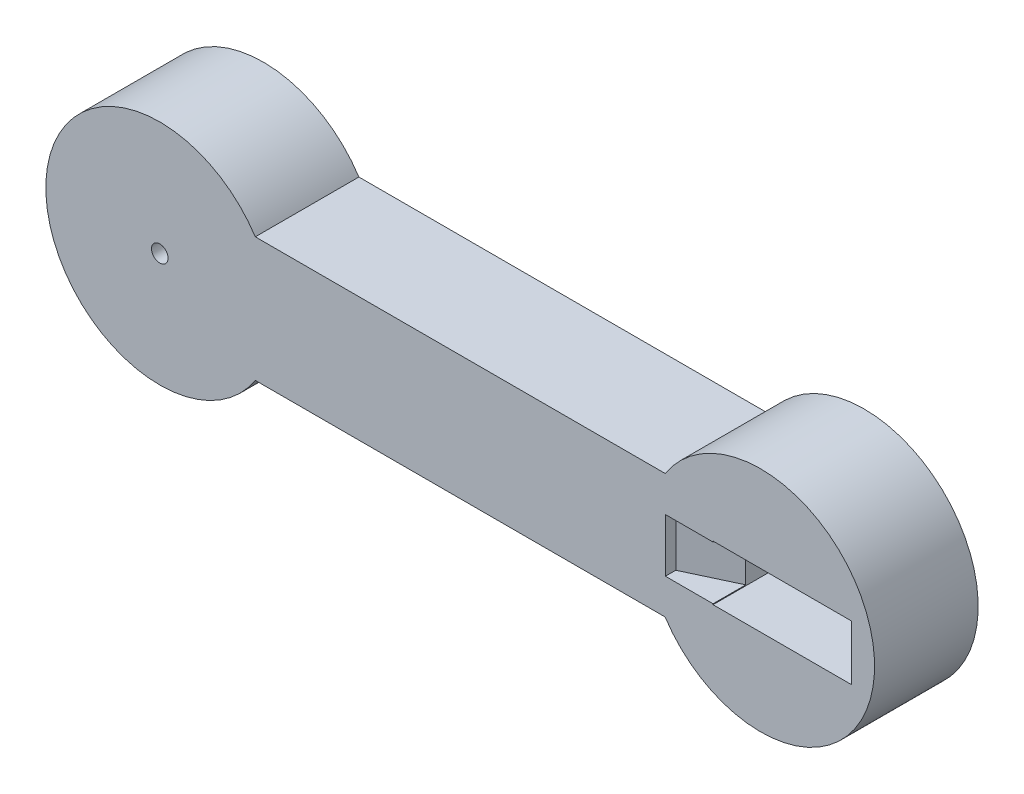
ISO-10303-21;
HEADER;
FILE_DESCRIPTION(('STEP AP214'),'2;1');
FILE_NAME('part.step','',(''),(''),'','','');
FILE_SCHEMA(('AUTOMOTIVE_DESIGN { 1 0 10303 214 1 1 1 1 }'));
ENDSEC;
DATA;
#1=APPLICATION_CONTEXT('core data for automotive mechanical design processes');
#2=APPLICATION_PROTOCOL_DEFINITION('international standard','automotive_design',2000,#1);
#3=PRODUCT_CONTEXT('',#1,'mechanical');
#4=PRODUCT('Part','Part','',(#3));
#5=PRODUCT_RELATED_PRODUCT_CATEGORY('part','',(#4));
#6=PRODUCT_DEFINITION_FORMATION('','',#4);
#7=PRODUCT_DEFINITION_CONTEXT('part definition',#1,'design');
#8=PRODUCT_DEFINITION('design','',#6,#7);
#9=PRODUCT_DEFINITION_SHAPE('','',#8);
#10=(LENGTH_UNIT() NAMED_UNIT(*) SI_UNIT(.MILLI.,.METRE.));
#11=(NAMED_UNIT(*) PLANE_ANGLE_UNIT() SI_UNIT($,.RADIAN.));
#12=(NAMED_UNIT(*) SI_UNIT($,.STERADIAN.) SOLID_ANGLE_UNIT());
#13=UNCERTAINTY_MEASURE_WITH_UNIT(LENGTH_MEASURE(1.E-05),#10,'distance_accuracy_value','');
#14=(GEOMETRIC_REPRESENTATION_CONTEXT(3) GLOBAL_UNCERTAINTY_ASSIGNED_CONTEXT((#13)) GLOBAL_UNIT_ASSIGNED_CONTEXT((#10,
#11,#12)) REPRESENTATION_CONTEXT('',''));
#15=CARTESIAN_POINT('',(0.,0.,0.));
#16=DIRECTION('',(0.,0.,1.));
#17=DIRECTION('',(1.,0.,0.));
#18=AXIS2_PLACEMENT_3D('',#15,#16,#17);
#19=CARTESIAN_POINT('',(0.,0.,25.));
#20=DIRECTION('',(0.,0.,1.));
#21=DIRECTION('',(1.,0.,0.));
#22=AXIS2_PLACEMENT_3D('',#19,#20,#21);
#23=PLANE('',#22);
#24=CARTESIAN_POINT('',(0.,0.,25.));
#25=DIRECTION('',(0.,0.,1.));
#26=DIRECTION('',(1.,0.,0.));
#27=AXIS2_PLACEMENT_3D('',#24,#25,#26);
#28=CIRCLE('',#27,2.);
#29=CARTESIAN_POINT('',(2.,0.,25.));
#30=VERTEX_POINT('',#29);
#31=EDGE_CURVE('E416',#30,#30,#28,.T.);
#32=ORIENTED_EDGE('',*,*,#31,.F.);
#33=EDGE_LOOP('',(#32));
#34=FACE_BOUND('',#33,.T.);
#35=DIRECTION('',(0.,1.,0.));
#36=VECTOR('',#35,1.);
#37=CARTESIAN_POINT('',(133.519342789878,6.64999999999998,25.));
#38=LINE('',#37,#36);
#39=CARTESIAN_POINT('',(133.519342789878,6.45,25.));
#40=VERTEX_POINT('',#39);
#41=CARTESIAN_POINT('',(133.519342789878,6.64999999999998,25.));
#42=VERTEX_POINT('',#41);
#43=EDGE_CURVE('E218',#40,#42,#38,.T.);
#44=ORIENTED_EDGE('',*,*,#43,.T.);
#45=DIRECTION('',(-1.,0.,0.));
#46=VECTOR('',#45,1.);
#47=CARTESIAN_POINT('',(0.,6.64999999999998,25.));
#48=LINE('',#47,#46);
#49=CARTESIAN_POINT('',(166.919342789878,6.64999999999998,25.));
#50=VERTEX_POINT('',#49);
#51=EDGE_CURVE('E202',#50,#42,#48,.T.);
#52=ORIENTED_EDGE('',*,*,#51,.F.);
#53=DIRECTION('',(0.,-1.,0.));
#54=VECTOR('',#53,1.);
#55=CARTESIAN_POINT('',(166.919342789878,6.64999999999998,25.));
#56=LINE('',#55,#54);
#57=CARTESIAN_POINT('',(166.919342789878,-6.65000000000003,25.));
#58=VERTEX_POINT('',#57);
#59=EDGE_CURVE('E209',#50,#58,#56,.T.);
#60=ORIENTED_EDGE('',*,*,#59,.T.);
#61=DIRECTION('',(1.,0.,0.));
#62=VECTOR('',#61,1.);
#63=CARTESIAN_POINT('',(0.,-6.65000000000002,25.));
#64=LINE('',#63,#62);
#65=CARTESIAN_POINT('',(133.519342789878,-6.65000000000003,25.));
#66=VERTEX_POINT('',#65);
#67=EDGE_CURVE('E187',#66,#58,#64,.T.);
#68=ORIENTED_EDGE('',*,*,#67,.F.);
#69=CARTESIAN_POINT('',(133.519342789878,-6.45,25.));
#70=VERTEX_POINT('',#69);
#71=EDGE_CURVE('E212',#66,#70,#38,.T.);
#72=ORIENTED_EDGE('',*,*,#71,.T.);
#73=DIRECTION('',(-1.,0.,0.));
#74=VECTOR('',#73,1.);
#75=CARTESIAN_POINT('',(0.,-6.45,25.));
#76=LINE('',#75,#74);
#77=CARTESIAN_POINT('',(122.019342789878,-6.45,25.));
#78=VERTEX_POINT('',#77);
#79=EDGE_CURVE('E257',#70,#78,#76,.T.);
#80=ORIENTED_EDGE('',*,*,#79,.T.);
#81=DIRECTION('',(0.,-1.,0.));
#82=VECTOR('',#81,1.);
#83=CARTESIAN_POINT('',(122.019342789878,6.45,25.));
#84=LINE('',#83,#82);
#85=CARTESIAN_POINT('',(122.019342789878,6.45,25.));
#86=VERTEX_POINT('',#85);
#87=EDGE_CURVE('E270',#86,#78,#84,.T.);
#88=ORIENTED_EDGE('',*,*,#87,.F.);
#89=DIRECTION('',(-1.,0.,0.));
#90=VECTOR('',#89,1.);
#91=CARTESIAN_POINT('',(0.,6.45,25.));
#92=LINE('',#91,#90);
#93=EDGE_CURVE('E258',#40,#86,#92,.T.);
#94=ORIENTED_EDGE('',*,*,#93,.F.);
#95=EDGE_LOOP('',(#44,#52,#60,#68,#72,#80,#88,#94));
#96=FACE_BOUND('',#95,.T.);
#97=CARTESIAN_POINT('',(0.,0.,25.));
#98=DIRECTION('',(0.,0.,1.));
#99=DIRECTION('',(1.,0.,0.));
#100=AXIS2_PLACEMENT_3D('',#97,#98,#99);
#101=CIRCLE('',#100,27.5);
#102=CARTESIAN_POINT('',(23.0488611432322,15.,25.));
#103=VERTEX_POINT('',#102);
#104=CARTESIAN_POINT('',(23.0488611432322,-15.,25.));
#105=VERTEX_POINT('',#104);
#106=EDGE_CURVE('E354',#103,#105,#101,.T.);
#107=ORIENTED_EDGE('',*,*,#106,.T.);
#108=DIRECTION('',(1.,0.,0.));
#109=VECTOR('',#108,1.);
#110=CARTESIAN_POINT('',(0.,-15.,25.));
#111=LINE('',#110,#109);
#112=CARTESIAN_POINT('',(121.951138856768,-15.,25.));
#113=VERTEX_POINT('',#112);
#114=EDGE_CURVE('E358',#105,#113,#111,.T.);
#115=ORIENTED_EDGE('',*,*,#114,.T.);
#116=CARTESIAN_POINT('',(145.,0.,25.));
#117=DIRECTION('',(0.,0.,1.));
#118=DIRECTION('',(1.,0.,0.));
#119=AXIS2_PLACEMENT_3D('',#116,#117,#118);
#120=CIRCLE('',#119,27.5);
#121=CARTESIAN_POINT('',(121.951138856768,15.,25.));
#122=VERTEX_POINT('',#121);
#123=EDGE_CURVE('E362',#113,#122,#120,.T.);
#124=ORIENTED_EDGE('',*,*,#123,.T.);
#125=DIRECTION('',(1.,0.,0.));
#126=VECTOR('',#125,1.);
#127=CARTESIAN_POINT('',(0.,15.,25.));
#128=LINE('',#127,#126);
#129=EDGE_CURVE('E365',#103,#122,#128,.T.);
#130=ORIENTED_EDGE('',*,*,#129,.F.);
#131=EDGE_LOOP('',(#107,#115,#124,#130));
#132=FACE_BOUND('',#131,.T.);
#133=ADVANCED_FACE('F49',(#34,#96,#132),#23,.T.);
#134=CARTESIAN_POINT('',(138.019342789879,0.,25.));
#135=DIRECTION('',(1.,0.,0.));
#136=DIRECTION('',(0.,0.,-1.));
#137=AXIS2_PLACEMENT_3D('',#134,#135,#136);
#138=PLANE('',#137);
#139=DIRECTION('',(0.,1.,0.));
#140=VECTOR('',#139,1.);
#141=CARTESIAN_POINT('',(138.019342789879,0.,6.5));
#142=LINE('',#141,#140);
#143=CARTESIAN_POINT('',(138.019342789879,-6.65000000000003,6.5));
#144=VERTEX_POINT('',#143);
#145=CARTESIAN_POINT('',(138.019342789879,6.64999999999998,6.5));
#146=VERTEX_POINT('',#145);
#147=EDGE_CURVE('E254',#144,#146,#142,.T.);
#148=ORIENTED_EDGE('',*,*,#147,.F.);
#149=DIRECTION('',(0.,0.,-1.));
#150=VECTOR('',#149,1.);
#151=CARTESIAN_POINT('',(138.019342789879,-6.65000000000003,25.));
#152=LINE('',#151,#150);
#153=CARTESIAN_POINT('',(138.019342789879,-6.65000000000003,4.5));
#154=VERTEX_POINT('',#153);
#155=EDGE_CURVE('E288',#144,#154,#152,.T.);
#156=ORIENTED_EDGE('',*,*,#155,.T.);
#157=DIRECTION('',(0.,-1.,0.));
#158=VECTOR('',#157,1.);
#159=CARTESIAN_POINT('',(138.019342789879,0.,4.5));
#160=LINE('',#159,#158);
#161=CARTESIAN_POINT('',(138.019342789879,6.64999999999998,4.5));
#162=VERTEX_POINT('',#161);
#163=EDGE_CURVE('E400',#162,#154,#160,.T.);
#164=ORIENTED_EDGE('',*,*,#163,.F.);
#165=DIRECTION('',(0.,0.,-1.));
#166=VECTOR('',#165,1.);
#167=CARTESIAN_POINT('',(138.019342789879,6.64999999999998,25.));
#168=LINE('',#167,#166);
#169=EDGE_CURVE('E201',#146,#162,#168,.T.);
#170=ORIENTED_EDGE('',*,*,#169,.F.);
#171=EDGE_LOOP('',(#148,#156,#164,#170));
#172=FACE_BOUND('',#171,.T.);
#173=ADVANCED_FACE('F429',(#172),#138,.T.);
#174=CARTESIAN_POINT('',(0.,0.,4.5));
#175=DIRECTION('',(0.,0.,-1.));
#176=DIRECTION('',(-1.,0.,0.));
#177=AXIS2_PLACEMENT_3D('',#174,#175,#176);
#178=PLANE('',#177);
#179=CARTESIAN_POINT('',(136.249999956768,0.,4.5));
#180=DIRECTION('',(0.,0.,-1.));
#181=DIRECTION('',(-1.,0.,0.));
#182=AXIS2_PLACEMENT_3D('',#179,#180,#181);
#183=CIRCLE('',#182,1.09999999999999);
#184=CARTESIAN_POINT('',(135.149999956768,0.,4.5));
#185=VERTEX_POINT('',#184);
#186=EDGE_CURVE('E227',#185,#185,#183,.T.);
#187=ORIENTED_EDGE('',*,*,#186,.F.);
#188=EDGE_LOOP('',(#187));
#189=FACE_BOUND('',#188,.T.);
#190=DIRECTION('',(1.,0.,0.));
#191=VECTOR('',#190,1.);
#192=CARTESIAN_POINT('',(133.519342789879,6.64999999999998,4.5));
#193=LINE('',#192,#191);
#194=CARTESIAN_POINT('',(133.519342789879,6.64999999999998,4.5));
#195=VERTEX_POINT('',#194);
#196=EDGE_CURVE('E314',#195,#162,#193,.T.);
#197=ORIENTED_EDGE('',*,*,#196,.T.);
#198=ORIENTED_EDGE('',*,*,#163,.T.);
#199=DIRECTION('',(-1.,0.,0.));
#200=VECTOR('',#199,1.);
#201=CARTESIAN_POINT('',(133.519342789879,-6.65000000000003,4.5));
#202=LINE('',#201,#200);
#203=CARTESIAN_POINT('',(133.519342789879,-6.65000000000003,4.5));
#204=VERTEX_POINT('',#203);
#205=EDGE_CURVE('E322',#154,#204,#202,.T.);
#206=ORIENTED_EDGE('',*,*,#205,.T.);
#207=DIRECTION('',(0.,1.,0.));
#208=VECTOR('',#207,1.);
#209=CARTESIAN_POINT('',(133.519342789879,-6.65000000000003,4.5));
#210=LINE('',#209,#208);
#211=EDGE_CURVE('E308',#204,#195,#210,.T.);
#212=ORIENTED_EDGE('',*,*,#211,.T.);
#213=EDGE_LOOP('',(#197,#198,#206,#212));
#214=FACE_BOUND('',#213,.T.);
#215=ADVANCED_FACE('F436',(#189,#214),#178,.T.);
#216=CARTESIAN_POINT('',(0.,0.,25.));
#217=DIRECTION('',(0.,0.,-1.));
#218=DIRECTION('',(-1.,0.,0.));
#219=AXIS2_PLACEMENT_3D('',#216,#217,#218);
#220=CYLINDRICAL_SURFACE('',#219,27.5);
#221=CARTESIAN_POINT('',(0.,0.,0.));
#222=DIRECTION('',(0.,0.,1.));
#223=DIRECTION('',(1.,0.,0.));
#224=AXIS2_PLACEMENT_3D('',#221,#222,#223);
#225=CIRCLE('',#224,27.5);
#226=CARTESIAN_POINT('',(23.0488611432322,15.,0.));
#227=VERTEX_POINT('',#226);
#228=CARTESIAN_POINT('',(23.0488611432322,-15.,0.));
#229=VERTEX_POINT('',#228);
#230=EDGE_CURVE('E343',#227,#229,#225,.T.);
#231=ORIENTED_EDGE('',*,*,#230,.T.);
#232=DIRECTION('',(0.,0.,-1.));
#233=VECTOR('',#232,1.);
#234=CARTESIAN_POINT('',(23.0488611432322,-15.,25.));
#235=LINE('',#234,#233);
#236=EDGE_CURVE('E392',#105,#229,#235,.T.);
#237=ORIENTED_EDGE('',*,*,#236,.F.);
#238=ORIENTED_EDGE('',*,*,#106,.F.);
#239=DIRECTION('',(0.,0.,-1.));
#240=VECTOR('',#239,1.);
#241=CARTESIAN_POINT('',(23.0488611432322,15.,25.));
#242=LINE('',#241,#240);
#243=EDGE_CURVE('E369',#103,#227,#242,.T.);
#244=ORIENTED_EDGE('',*,*,#243,.T.);
#245=EDGE_LOOP('',(#231,#237,#238,#244));
#246=FACE_BOUND('',#245,.T.);
#247=ADVANCED_FACE('F51',(#246),#220,.T.);
#248=CARTESIAN_POINT('',(0.,-15.,25.));
#249=DIRECTION('',(0.,1.,0.));
#250=DIRECTION('',(-1.,0.,0.));
#251=AXIS2_PLACEMENT_3D('',#248,#249,#250);
#252=PLANE('',#251);
#253=DIRECTION('',(1.,0.,0.));
#254=VECTOR('',#253,1.);
#255=CARTESIAN_POINT('',(0.,-15.,0.));
#256=LINE('',#255,#254);
#257=CARTESIAN_POINT('',(121.951138856768,-15.,0.));
#258=VERTEX_POINT('',#257);
#259=EDGE_CURVE('E373',#229,#258,#256,.T.);
#260=ORIENTED_EDGE('',*,*,#259,.T.);
#261=DIRECTION('',(0.,0.,-1.));
#262=VECTOR('',#261,1.);
#263=CARTESIAN_POINT('',(121.951138856768,-15.,25.));
#264=LINE('',#263,#262);
#265=EDGE_CURVE('E388',#113,#258,#264,.T.);
#266=ORIENTED_EDGE('',*,*,#265,.F.);
#267=ORIENTED_EDGE('',*,*,#114,.F.);
#268=ORIENTED_EDGE('',*,*,#236,.T.);
#269=EDGE_LOOP('',(#260,#266,#267,#268));
#270=FACE_BOUND('',#269,.T.);
#271=ADVANCED_FACE('F453',(#270),#252,.F.);
#272=CARTESIAN_POINT('',(145.,0.,25.));
#273=DIRECTION('',(0.,0.,-1.));
#274=DIRECTION('',(-1.,0.,0.));
#275=AXIS2_PLACEMENT_3D('',#272,#273,#274);
#276=CYLINDRICAL_SURFACE('',#275,27.5);
#277=CARTESIAN_POINT('',(145.,0.,0.));
#278=DIRECTION('',(0.,0.,1.));
#279=DIRECTION('',(1.,0.,0.));
#280=AXIS2_PLACEMENT_3D('',#277,#278,#279);
#281=CIRCLE('',#280,27.5);
#282=CARTESIAN_POINT('',(121.951138856768,15.,0.));
#283=VERTEX_POINT('',#282);
#284=EDGE_CURVE('E376',#258,#283,#281,.T.);
#285=ORIENTED_EDGE('',*,*,#284,.T.);
#286=DIRECTION('',(0.,0.,-1.));
#287=VECTOR('',#286,1.);
#288=CARTESIAN_POINT('',(121.951138856768,15.,25.));
#289=LINE('',#288,#287);
#290=EDGE_CURVE('E385',#122,#283,#289,.T.);
#291=ORIENTED_EDGE('',*,*,#290,.F.);
#292=ORIENTED_EDGE('',*,*,#123,.F.);
#293=ORIENTED_EDGE('',*,*,#265,.T.);
#294=EDGE_LOOP('',(#285,#291,#292,#293));
#295=FACE_BOUND('',#294,.T.);
#296=ADVANCED_FACE('F450',(#295),#276,.T.);
#297=CARTESIAN_POINT('',(0.,15.,25.));
#298=DIRECTION('',(0.,1.,0.));
#299=DIRECTION('',(-1.,0.,0.));
#300=AXIS2_PLACEMENT_3D('',#297,#298,#299);
#301=PLANE('',#300);
#302=DIRECTION('',(1.,0.,0.));
#303=VECTOR('',#302,1.);
#304=CARTESIAN_POINT('',(0.,15.,0.));
#305=LINE('',#304,#303);
#306=EDGE_CURVE('E359',#227,#283,#305,.T.);
#307=ORIENTED_EDGE('',*,*,#306,.F.);
#308=ORIENTED_EDGE('',*,*,#243,.F.);
#309=ORIENTED_EDGE('',*,*,#129,.T.);
#310=ORIENTED_EDGE('',*,*,#290,.T.);
#311=EDGE_LOOP('',(#307,#308,#309,#310));
#312=FACE_BOUND('',#311,.T.);
#313=ADVANCED_FACE('F446',(#312),#301,.T.);
#314=CARTESIAN_POINT('',(0.,0.,0.));
#315=DIRECTION('',(0.,0.,1.));
#316=DIRECTION('',(1.,0.,0.));
#317=AXIS2_PLACEMENT_3D('',#314,#315,#316);
#318=PLANE('',#317);
#319=CARTESIAN_POINT('',(0.,0.,0.));
#320=DIRECTION('',(0.,0.,-1.));
#321=DIRECTION('',(-1.,0.,0.));
#322=AXIS2_PLACEMENT_3D('',#319,#320,#321);
#323=CIRCLE('',#322,20.0000000000004);
#324=CARTESIAN_POINT('',(-20.0000000000004,0.,0.));
#325=VERTEX_POINT('',#324);
#326=EDGE_CURVE('E291',#325,#325,#323,.T.);
#327=ORIENTED_EDGE('',*,*,#326,.F.);
#328=EDGE_LOOP('',(#327));
#329=FACE_BOUND('',#328,.T.);
#330=DIRECTION('',(1.,0.,0.));
#331=VECTOR('',#330,1.);
#332=CARTESIAN_POINT('',(133.519342789879,6.64999999999998,0.));
#333=LINE('',#332,#331);
#334=CARTESIAN_POINT('',(133.519342789879,6.64999999999998,0.));
#335=VERTEX_POINT('',#334);
#336=CARTESIAN_POINT('',(166.919342789878,6.64999999999997,0.));
#337=VERTEX_POINT('',#336);
#338=EDGE_CURVE('E330',#335,#337,#333,.T.);
#339=ORIENTED_EDGE('',*,*,#338,.F.);
#340=DIRECTION('',(0.,1.,0.));
#341=VECTOR('',#340,1.);
#342=CARTESIAN_POINT('',(133.519342789879,-6.65000000000003,0.));
#343=LINE('',#342,#341);
#344=CARTESIAN_POINT('',(133.519342789879,-6.65000000000003,0.));
#345=VERTEX_POINT('',#344);
#346=EDGE_CURVE('E304',#345,#335,#343,.T.);
#347=ORIENTED_EDGE('',*,*,#346,.F.);
#348=DIRECTION('',(-1.,0.,0.));
#349=VECTOR('',#348,1.);
#350=CARTESIAN_POINT('',(133.519342789879,-6.65000000000003,0.));
#351=LINE('',#350,#349);
#352=CARTESIAN_POINT('',(166.919342789878,-6.65000000000003,0.));
#353=VERTEX_POINT('',#352);
#354=EDGE_CURVE('E313',#353,#345,#351,.T.);
#355=ORIENTED_EDGE('',*,*,#354,.F.);
#356=DIRECTION('',(0.,-1.,0.));
#357=VECTOR('',#356,1.);
#358=CARTESIAN_POINT('',(166.919342789878,-6.65000000000003,0.));
#359=LINE('',#358,#357);
#360=EDGE_CURVE('E333',#337,#353,#359,.T.);
#361=ORIENTED_EDGE('',*,*,#360,.F.);
#362=EDGE_LOOP('',(#339,#347,#355,#361));
#363=FACE_BOUND('',#362,.T.);
#364=ORIENTED_EDGE('',*,*,#230,.F.);
#365=ORIENTED_EDGE('',*,*,#306,.T.);
#366=ORIENTED_EDGE('',*,*,#284,.F.);
#367=ORIENTED_EDGE('',*,*,#259,.F.);
#368=EDGE_LOOP('',(#364,#365,#366,#367));
#369=FACE_BOUND('',#368,.T.);
#370=ADVANCED_FACE('F443',(#329,#363,#369),#318,.F.);
#371=CARTESIAN_POINT('',(133.519342789879,-6.65000000000003,4.5));
#372=DIRECTION('',(-1.,0.,0.));
#373=DIRECTION('',(0.,0.,1.));
#374=AXIS2_PLACEMENT_3D('',#371,#372,#373);
#375=PLANE('',#374);
#376=ORIENTED_EDGE('',*,*,#346,.T.);
#377=DIRECTION('',(0.,0.,-1.));
#378=VECTOR('',#377,1.);
#379=CARTESIAN_POINT('',(133.519342789879,6.64999999999998,4.5));
#380=LINE('',#379,#378);
#381=EDGE_CURVE('E327',#195,#335,#380,.T.);
#382=ORIENTED_EDGE('',*,*,#381,.F.);
#383=ORIENTED_EDGE('',*,*,#211,.F.);
#384=DIRECTION('',(0.,0.,-1.));
#385=VECTOR('',#384,1.);
#386=CARTESIAN_POINT('',(133.519342789879,-6.65000000000003,4.5));
#387=LINE('',#386,#385);
#388=EDGE_CURVE('E339',#204,#345,#387,.T.);
#389=ORIENTED_EDGE('',*,*,#388,.T.);
#390=EDGE_LOOP('',(#376,#382,#383,#389));
#391=FACE_BOUND('',#390,.T.);
#392=ADVANCED_FACE('F441',(#391),#375,.F.);
#393=CARTESIAN_POINT('',(133.519342789879,-6.65000000000003,4.5));
#394=DIRECTION('',(0.,-1.,0.));
#395=DIRECTION('',(1.,0.,0.));
#396=AXIS2_PLACEMENT_3D('',#393,#394,#395);
#397=PLANE('',#396);
#398=ORIENTED_EDGE('',*,*,#155,.F.);
#399=DIRECTION('',(-1.,0.,0.));
#400=VECTOR('',#399,1.);
#401=CARTESIAN_POINT('',(166.919342789878,-6.65000000000003,6.5));
#402=LINE('',#401,#400);
#403=CARTESIAN_POINT('',(133.519342789878,-6.65000000000003,6.5));
#404=VERTEX_POINT('',#403);
#405=EDGE_CURVE('E233',#144,#404,#402,.T.);
#406=ORIENTED_EDGE('',*,*,#405,.T.);
#407=DIRECTION('',(0.,0.,-1.));
#408=VECTOR('',#407,1.);
#409=CARTESIAN_POINT('',(133.519342789878,-6.65000000000003,25.));
#410=LINE('',#409,#408);
#411=EDGE_CURVE('E195',#66,#404,#410,.T.);
#412=ORIENTED_EDGE('',*,*,#411,.F.);
#413=ORIENTED_EDGE('',*,*,#67,.T.);
#414=DIRECTION('',(0.,0.,-1.));
#415=VECTOR('',#414,1.);
#416=CARTESIAN_POINT('',(166.919342789878,-6.65000000000003,25.));
#417=LINE('',#416,#415);
#418=CARTESIAN_POINT('',(166.919342789878,-6.65000000000003,6.5));
#419=VERTEX_POINT('',#418);
#420=EDGE_CURVE('E192',#58,#419,#417,.T.);
#421=ORIENTED_EDGE('',*,*,#420,.T.);
#422=CARTESIAN_POINT('',(162.419342789878,-6.65000000000003,6.5));
#423=VERTEX_POINT('',#422);
#424=EDGE_CURVE('E234',#419,#423,#402,.T.);
#425=ORIENTED_EDGE('',*,*,#424,.T.);
#426=DIRECTION('',(0.,0.,-1.));
#427=VECTOR('',#426,1.);
#428=CARTESIAN_POINT('',(162.419342789878,-6.65000000000003,25.));
#429=LINE('',#428,#427);
#430=CARTESIAN_POINT('',(162.419342789878,-6.65000000000003,4.5));
#431=VERTEX_POINT('',#430);
#432=EDGE_CURVE('E292',#423,#431,#429,.T.);
#433=ORIENTED_EDGE('',*,*,#432,.T.);
#434=CARTESIAN_POINT('',(166.919342789878,-6.65000000000003,4.5));
#435=VERTEX_POINT('',#434);
#436=EDGE_CURVE('E323',#435,#431,#202,.T.);
#437=ORIENTED_EDGE('',*,*,#436,.F.);
#438=DIRECTION('',(0.,0.,-1.));
#439=VECTOR('',#438,1.);
#440=CARTESIAN_POINT('',(166.919342789878,-6.65000000000003,4.5));
#441=LINE('',#440,#439);
#442=EDGE_CURVE('E344',#435,#353,#441,.T.);
#443=ORIENTED_EDGE('',*,*,#442,.T.);
#444=ORIENTED_EDGE('',*,*,#354,.T.);
#445=ORIENTED_EDGE('',*,*,#388,.F.);
#446=ORIENTED_EDGE('',*,*,#205,.F.);
#447=EDGE_LOOP('',(#398,#406,#412,#413,#421,#425,#433,#437,#443,#444,#445,#446));
#448=FACE_BOUND('',#447,.T.);
#449=ADVANCED_FACE('F190',(#448),#397,.F.);
#450=CARTESIAN_POINT('',(166.919342789878,-6.65000000000003,4.5));
#451=DIRECTION('',(1.,0.,0.));
#452=DIRECTION('',(0.,0.,-1.));
#453=AXIS2_PLACEMENT_3D('',#450,#451,#452);
#454=PLANE('',#453);
#455=ORIENTED_EDGE('',*,*,#360,.T.);
#456=ORIENTED_EDGE('',*,*,#442,.F.);
#457=DIRECTION('',(0.,-1.,0.));
#458=VECTOR('',#457,1.);
#459=CARTESIAN_POINT('',(166.919342789878,-6.65000000000003,4.5));
#460=LINE('',#459,#458);
#461=CARTESIAN_POINT('',(166.919342789878,6.64999999999997,4.5));
#462=VERTEX_POINT('',#461);
#463=EDGE_CURVE('E318',#462,#435,#460,.T.);
#464=ORIENTED_EDGE('',*,*,#463,.F.);
#465=DIRECTION('',(0.,0.,-1.));
#466=VECTOR('',#465,1.);
#467=CARTESIAN_POINT('',(166.919342789878,6.64999999999997,4.5));
#468=LINE('',#467,#466);
#469=EDGE_CURVE('E347',#462,#337,#468,.T.);
#470=ORIENTED_EDGE('',*,*,#469,.T.);
#471=EDGE_LOOP('',(#455,#456,#464,#470));
#472=FACE_BOUND('',#471,.T.);
#473=ADVANCED_FACE('F495',(#472),#454,.F.);
#474=CARTESIAN_POINT('',(133.519342789879,6.64999999999998,4.5));
#475=DIRECTION('',(0.,1.,0.));
#476=DIRECTION('',(-1.,0.,0.));
#477=AXIS2_PLACEMENT_3D('',#474,#475,#476);
#478=PLANE('',#477);
#479=DIRECTION('',(0.,0.,-1.));
#480=VECTOR('',#479,1.);
#481=CARTESIAN_POINT('',(162.419342789878,6.64999999999997,25.));
#482=LINE('',#481,#480);
#483=CARTESIAN_POINT('',(162.419342789878,6.64999999999997,6.5));
#484=VERTEX_POINT('',#483);
#485=CARTESIAN_POINT('',(162.419342789878,6.64999999999997,4.5));
#486=VERTEX_POINT('',#485);
#487=EDGE_CURVE('E295',#484,#486,#482,.T.);
#488=ORIENTED_EDGE('',*,*,#487,.F.);
#489=DIRECTION('',(1.,0.,0.));
#490=VECTOR('',#489,1.);
#491=CARTESIAN_POINT('',(166.919342789878,6.64999999999998,6.5));
#492=LINE('',#491,#490);
#493=CARTESIAN_POINT('',(166.919342789878,6.64999999999998,6.5));
#494=VERTEX_POINT('',#493);
#495=EDGE_CURVE('E67',#484,#494,#492,.T.);
#496=ORIENTED_EDGE('',*,*,#495,.T.);
#497=DIRECTION('',(0.,0.,-1.));
#498=VECTOR('',#497,1.);
#499=CARTESIAN_POINT('',(166.919342789878,6.64999999999998,25.));
#500=LINE('',#499,#498);
#501=EDGE_CURVE('E241',#50,#494,#500,.T.);
#502=ORIENTED_EDGE('',*,*,#501,.F.);
#503=ORIENTED_EDGE('',*,*,#51,.T.);
#504=DIRECTION('',(0.,0.,-1.));
#505=VECTOR('',#504,1.);
#506=CARTESIAN_POINT('',(133.519342789878,6.64999999999998,25.));
#507=LINE('',#506,#505);
#508=CARTESIAN_POINT('',(133.519342789878,6.64999999999998,6.5));
#509=VERTEX_POINT('',#508);
#510=EDGE_CURVE('E244',#42,#509,#507,.T.);
#511=ORIENTED_EDGE('',*,*,#510,.T.);
#512=EDGE_CURVE('E219',#509,#146,#492,.T.);
#513=ORIENTED_EDGE('',*,*,#512,.T.);
#514=ORIENTED_EDGE('',*,*,#169,.T.);
#515=ORIENTED_EDGE('',*,*,#196,.F.);
#516=ORIENTED_EDGE('',*,*,#381,.T.);
#517=ORIENTED_EDGE('',*,*,#338,.T.);
#518=ORIENTED_EDGE('',*,*,#469,.F.);
#519=EDGE_CURVE('E312',#486,#462,#193,.T.);
#520=ORIENTED_EDGE('',*,*,#519,.F.);
#521=EDGE_LOOP('',(#488,#496,#502,#503,#511,#513,#514,#515,#516,#517,#518,#520));
#522=FACE_BOUND('',#521,.T.);
#523=ADVANCED_FACE('F486',(#522),#478,.F.);
#524=CARTESIAN_POINT('',(164.249999956768,0.,4.5));
#525=DIRECTION('',(0.,0.,-1.));
#526=DIRECTION('',(-1.,0.,0.));
#527=AXIS2_PLACEMENT_3D('',#524,#525,#526);
#528=CIRCLE('',#527,1.09999999999999);
#529=CARTESIAN_POINT('',(163.149999956768,0.,4.5));
#530=VERTEX_POINT('',#529);
#531=EDGE_CURVE('E408',#530,#530,#528,.T.);
#532=ORIENTED_EDGE('',*,*,#531,.F.);
#533=EDGE_LOOP('',(#532));
#534=FACE_BOUND('',#533,.T.);
#535=DIRECTION('',(0.,-1.,0.));
#536=VECTOR('',#535,1.);
#537=CARTESIAN_POINT('',(162.419342789878,0.,4.5));
#538=LINE('',#537,#536);
#539=EDGE_CURVE('E396',#486,#431,#538,.T.);
#540=ORIENTED_EDGE('',*,*,#539,.F.);
#541=ORIENTED_EDGE('',*,*,#519,.T.);
#542=ORIENTED_EDGE('',*,*,#463,.T.);
#543=ORIENTED_EDGE('',*,*,#436,.T.);
#544=EDGE_LOOP('',(#540,#541,#542,#543));
#545=FACE_BOUND('',#544,.T.);
#546=ADVANCED_FACE('F476',(#534,#545),#178,.T.);
#547=CARTESIAN_POINT('',(0.,0.,5.));
#548=DIRECTION('',(0.,0.,-1.));
#549=DIRECTION('',(-1.,0.,0.));
#550=AXIS2_PLACEMENT_3D('',#547,#548,#549);
#551=CYLINDRICAL_SURFACE('',#550,20.0000000000004);
#552=CARTESIAN_POINT('',(0.,0.,5.));
#553=DIRECTION('',(0.,0.,-1.));
#554=DIRECTION('',(-1.,0.,0.));
#555=AXIS2_PLACEMENT_3D('',#552,#553,#554);
#556=CIRCLE('',#555,20.0000000000004);
#557=CARTESIAN_POINT('',(-20.0000000000004,0.,5.));
#558=VERTEX_POINT('',#557);
#559=EDGE_CURVE('E300',#558,#558,#556,.T.);
#560=ORIENTED_EDGE('',*,*,#559,.F.);
#561=EDGE_LOOP('',(#560));
#562=FACE_BOUND('',#561,.T.);
#563=ORIENTED_EDGE('',*,*,#326,.T.);
#564=EDGE_LOOP('',(#563));
#565=FACE_BOUND('',#564,.T.);
#566=ADVANCED_FACE('F485',(#562,#565),#551,.F.);
#567=CARTESIAN_POINT('',(0.,0.,5.));
#568=DIRECTION('',(0.,0.,-1.));
#569=DIRECTION('',(-1.,0.,0.));
#570=AXIS2_PLACEMENT_3D('',#567,#568,#569);
#571=PLANE('',#570);
#572=CARTESIAN_POINT('',(0.,0.,5.));
#573=DIRECTION('',(0.,0.,-1.));
#574=DIRECTION('',(-1.,0.,0.));
#575=AXIS2_PLACEMENT_3D('',#572,#573,#574);
#576=CIRCLE('',#575,2.);
#577=CARTESIAN_POINT('',(2.,0.,5.));
#578=VERTEX_POINT('',#577);
#579=EDGE_CURVE('E409',#578,#578,#576,.F.);
#580=ORIENTED_EDGE('',*,*,#579,.T.);
#581=EDGE_LOOP('',(#580));
#582=FACE_BOUND('',#581,.T.);
#583=ORIENTED_EDGE('',*,*,#559,.T.);
#584=EDGE_LOOP('',(#583));
#585=FACE_BOUND('',#584,.T.);
#586=ADVANCED_FACE('F492',(#582,#585),#571,.T.);
#587=CARTESIAN_POINT('',(162.419342789878,0.,25.));
#588=DIRECTION('',(1.,0.,0.));
#589=DIRECTION('',(0.,0.,-1.));
#590=AXIS2_PLACEMENT_3D('',#587,#588,#589);
#591=PLANE('',#590);
#592=ORIENTED_EDGE('',*,*,#432,.F.);
#593=DIRECTION('',(0.,1.,0.));
#594=VECTOR('',#593,1.);
#595=CARTESIAN_POINT('',(162.419342789878,0.,6.5));
#596=LINE('',#595,#594);
#597=EDGE_CURVE('E12',#423,#484,#596,.T.);
#598=ORIENTED_EDGE('',*,*,#597,.T.);
#599=ORIENTED_EDGE('',*,*,#487,.T.);
#600=ORIENTED_EDGE('',*,*,#539,.T.);
#601=EDGE_LOOP('',(#592,#598,#599,#600));
#602=FACE_BOUND('',#601,.T.);
#603=ADVANCED_FACE('F554',(#602),#591,.F.);
#604=CARTESIAN_POINT('',(30.6279840894497,6.45,65.339699390826));
#605=DIRECTION('',(-0.42443387623072,0.,-0.905458935958868));
#606=DIRECTION('',(-0.905458935958868,0.,0.42443387623072));
#607=AXIS2_PLACEMENT_3D('',#604,#605,#606);
#608=PLANE('',#607);
#609=DIRECTION('',(0.905458935958868,0.,-0.42443387623072));
#610=VECTOR('',#609,1.);
#611=CARTESIAN_POINT('',(30.6279840894497,-6.45,65.339699390826));
#612=LINE('',#611,#610);
#613=CARTESIAN_POINT('',(122.019342789878,-6.45,22.5));
#614=VERTEX_POINT('',#613);
#615=CARTESIAN_POINT('',(133.519342789878,-6.45,17.109375));
#616=VERTEX_POINT('',#615);
#617=EDGE_CURVE('E262',#614,#616,#612,.T.);
#618=ORIENTED_EDGE('',*,*,#617,.T.);
#619=DIRECTION('',(0.,1.,0.));
#620=VECTOR('',#619,1.);
#621=CARTESIAN_POINT('',(133.519342789878,6.45,17.109375));
#622=LINE('',#621,#620);
#623=CARTESIAN_POINT('',(133.519342789878,6.45,17.109375));
#624=VERTEX_POINT('',#623);
#625=EDGE_CURVE('E74',#616,#624,#622,.T.);
#626=ORIENTED_EDGE('',*,*,#625,.T.);
#627=DIRECTION('',(0.905458935958868,0.,-0.42443387623072));
#628=VECTOR('',#627,1.);
#629=CARTESIAN_POINT('',(30.6279840894497,6.45,65.339699390826));
#630=LINE('',#629,#628);
#631=CARTESIAN_POINT('',(122.019342789878,6.45,22.5));
#632=VERTEX_POINT('',#631);
#633=EDGE_CURVE('E266',#632,#624,#630,.T.);
#634=ORIENTED_EDGE('',*,*,#633,.F.);
#635=DIRECTION('',(0.,-1.,0.));
#636=VECTOR('',#635,1.);
#637=CARTESIAN_POINT('',(122.019342789878,6.45,22.5));
#638=LINE('',#637,#636);
#639=EDGE_CURVE('E280',#632,#614,#638,.T.);
#640=ORIENTED_EDGE('',*,*,#639,.T.);
#641=EDGE_LOOP('',(#618,#626,#634,#640));
#642=FACE_BOUND('',#641,.T.);
#643=ADVANCED_FACE('F551',(#642),#608,.F.);
#644=CARTESIAN_POINT('',(122.019342789878,6.45,0.));
#645=DIRECTION('',(-1.,0.,0.));
#646=DIRECTION('',(0.,0.,1.));
#647=AXIS2_PLACEMENT_3D('',#644,#645,#646);
#648=PLANE('',#647);
#649=DIRECTION('',(0.,0.,-1.));
#650=VECTOR('',#649,1.);
#651=CARTESIAN_POINT('',(122.019342789878,-6.45,0.));
#652=LINE('',#651,#650);
#653=EDGE_CURVE('E273',#78,#614,#652,.T.);
#654=ORIENTED_EDGE('',*,*,#653,.T.);
#655=ORIENTED_EDGE('',*,*,#639,.F.);
#656=DIRECTION('',(0.,0.,-1.));
#657=VECTOR('',#656,1.);
#658=CARTESIAN_POINT('',(122.019342789878,6.45,0.));
#659=LINE('',#658,#657);
#660=EDGE_CURVE('E261',#86,#632,#659,.T.);
#661=ORIENTED_EDGE('',*,*,#660,.F.);
#662=ORIENTED_EDGE('',*,*,#87,.T.);
#663=EDGE_LOOP('',(#654,#655,#661,#662));
#664=FACE_BOUND('',#663,.T.);
#665=ADVANCED_FACE('F546',(#664),#648,.F.);
#666=CARTESIAN_POINT('',(0.,6.45,0.));
#667=DIRECTION('',(0.,-1.,0.));
#668=DIRECTION('',(0.,0.,-1.));
#669=AXIS2_PLACEMENT_3D('',#666,#667,#668);
#670=PLANE('',#669);
#671=DIRECTION('',(0.,0.,-1.));
#672=VECTOR('',#671,1.);
#673=CARTESIAN_POINT('',(133.519342789878,6.45,0.));
#674=LINE('',#673,#672);
#675=EDGE_CURVE('E251',#40,#624,#674,.T.);
#676=ORIENTED_EDGE('',*,*,#675,.F.);
#677=ORIENTED_EDGE('',*,*,#93,.T.);
#678=ORIENTED_EDGE('',*,*,#660,.T.);
#679=ORIENTED_EDGE('',*,*,#633,.T.);
#680=EDGE_LOOP('',(#676,#677,#678,#679));
#681=FACE_BOUND('',#680,.T.);
#682=ADVANCED_FACE('F543',(#681),#670,.T.);
#683=CARTESIAN_POINT('',(0.,-6.45,0.));
#684=DIRECTION('',(0.,-1.,0.));
#685=DIRECTION('',(0.,0.,-1.));
#686=AXIS2_PLACEMENT_3D('',#683,#684,#685);
#687=PLANE('',#686);
#688=ORIENTED_EDGE('',*,*,#79,.F.);
#689=DIRECTION('',(0.,0.,-1.));
#690=VECTOR('',#689,1.);
#691=CARTESIAN_POINT('',(133.519342789878,-6.45,0.));
#692=LINE('',#691,#690);
#693=EDGE_CURVE('E59',#70,#616,#692,.T.);
#694=ORIENTED_EDGE('',*,*,#693,.T.);
#695=ORIENTED_EDGE('',*,*,#617,.F.);
#696=ORIENTED_EDGE('',*,*,#653,.F.);
#697=EDGE_LOOP('',(#688,#694,#695,#696));
#698=FACE_BOUND('',#697,.T.);
#699=ADVANCED_FACE('F534',(#698),#687,.F.);
#700=CARTESIAN_POINT('',(133.519342789878,6.64999999999998,25.));
#701=DIRECTION('',(-1.,0.,0.));
#702=DIRECTION('',(0.,0.,1.));
#703=AXIS2_PLACEMENT_3D('',#700,#701,#702);
#704=PLANE('',#703);
#705=ORIENTED_EDGE('',*,*,#675,.T.);
#706=ORIENTED_EDGE('',*,*,#625,.F.);
#707=ORIENTED_EDGE('',*,*,#693,.F.);
#708=ORIENTED_EDGE('',*,*,#71,.F.);
#709=ORIENTED_EDGE('',*,*,#411,.T.);
#710=DIRECTION('',(0.,1.,0.));
#711=VECTOR('',#710,1.);
#712=CARTESIAN_POINT('',(133.519342789878,6.64999999999998,6.5));
#713=LINE('',#712,#711);
#714=EDGE_CURVE('E237',#404,#509,#713,.T.);
#715=ORIENTED_EDGE('',*,*,#714,.T.);
#716=ORIENTED_EDGE('',*,*,#510,.F.);
#717=ORIENTED_EDGE('',*,*,#43,.F.);
#718=EDGE_LOOP('',(#705,#706,#707,#708,#709,#715,#716,#717));
#719=FACE_BOUND('',#718,.T.);
#720=ADVANCED_FACE('F524',(#719),#704,.F.);
#721=CARTESIAN_POINT('',(0.,0.,6.5));
#722=DIRECTION('',(0.,0.,-1.));
#723=DIRECTION('',(-1.,0.,0.));
#724=AXIS2_PLACEMENT_3D('',#721,#722,#723);
#725=PLANE('',#724);
#726=CARTESIAN_POINT('',(136.249999956768,0.,6.5));
#727=DIRECTION('',(0.,0.,-1.));
#728=DIRECTION('',(-1.,0.,0.));
#729=AXIS2_PLACEMENT_3D('',#726,#727,#728);
#730=CIRCLE('',#729,1.09999999999999);
#731=CARTESIAN_POINT('',(135.149999956768,0.,6.5));
#732=VERTEX_POINT('',#731);
#733=EDGE_CURVE('E53',#732,#732,#730,.T.);
#734=ORIENTED_EDGE('',*,*,#733,.T.);
#735=EDGE_LOOP('',(#734));
#736=FACE_BOUND('',#735,.T.);
#737=ORIENTED_EDGE('',*,*,#147,.T.);
#738=ORIENTED_EDGE('',*,*,#512,.F.);
#739=ORIENTED_EDGE('',*,*,#714,.F.);
#740=ORIENTED_EDGE('',*,*,#405,.F.);
#741=EDGE_LOOP('',(#737,#738,#739,#740));
#742=FACE_BOUND('',#741,.T.);
#743=ADVANCED_FACE('F526',(#736,#742),#725,.F.);
#744=CARTESIAN_POINT('',(164.249999956768,0.,6.5));
#745=DIRECTION('',(0.,0.,-1.));
#746=DIRECTION('',(-1.,0.,0.));
#747=AXIS2_PLACEMENT_3D('',#744,#745,#746);
#748=CIRCLE('',#747,1.09999999999999);
#749=CARTESIAN_POINT('',(163.149999956768,0.,6.5));
#750=VERTEX_POINT('',#749);
#751=EDGE_CURVE('E405',#750,#750,#748,.T.);
#752=ORIENTED_EDGE('',*,*,#751,.T.);
#753=EDGE_LOOP('',(#752));
#754=FACE_BOUND('',#753,.T.);
#755=ORIENTED_EDGE('',*,*,#424,.F.);
#756=DIRECTION('',(0.,-1.,0.));
#757=VECTOR('',#756,1.);
#758=CARTESIAN_POINT('',(166.919342789878,6.64999999999998,6.5));
#759=LINE('',#758,#757);
#760=EDGE_CURVE('E210',#494,#419,#759,.T.);
#761=ORIENTED_EDGE('',*,*,#760,.F.);
#762=ORIENTED_EDGE('',*,*,#495,.F.);
#763=ORIENTED_EDGE('',*,*,#597,.F.);
#764=EDGE_LOOP('',(#755,#761,#762,#763));
#765=FACE_BOUND('',#764,.T.);
#766=ADVANCED_FACE('F527',(#754,#765),#725,.F.);
#767=CARTESIAN_POINT('',(166.919342789878,6.64999999999998,25.));
#768=DIRECTION('',(1.,0.,0.));
#769=DIRECTION('',(0.,0.,-1.));
#770=AXIS2_PLACEMENT_3D('',#767,#768,#769);
#771=PLANE('',#770);
#772=ORIENTED_EDGE('',*,*,#760,.T.);
#773=ORIENTED_EDGE('',*,*,#420,.F.);
#774=ORIENTED_EDGE('',*,*,#59,.F.);
#775=ORIENTED_EDGE('',*,*,#501,.T.);
#776=EDGE_LOOP('',(#772,#773,#774,#775));
#777=FACE_BOUND('',#776,.T.);
#778=ADVANCED_FACE('F207',(#777),#771,.F.);
#779=CARTESIAN_POINT('',(164.249999956768,0.,25.));
#780=DIRECTION('',(0.,0.,-1.));
#781=DIRECTION('',(-1.,0.,0.));
#782=AXIS2_PLACEMENT_3D('',#779,#780,#781);
#783=CYLINDRICAL_SURFACE('',#782,1.09999999999999);
#784=ORIENTED_EDGE('',*,*,#531,.T.);
#785=EDGE_LOOP('',(#784));
#786=FACE_BOUND('',#785,.T.);
#787=ORIENTED_EDGE('',*,*,#751,.F.);
#788=EDGE_LOOP('',(#787));
#789=FACE_BOUND('',#788,.T.);
#790=ADVANCED_FACE('F542',(#786,#789),#783,.F.);
#791=CARTESIAN_POINT('',(136.249999956768,0.,25.));
#792=DIRECTION('',(0.,0.,-1.));
#793=DIRECTION('',(-1.,0.,0.));
#794=AXIS2_PLACEMENT_3D('',#791,#792,#793);
#795=CYLINDRICAL_SURFACE('',#794,1.09999999999999);
#796=ORIENTED_EDGE('',*,*,#186,.T.);
#797=EDGE_LOOP('',(#796));
#798=FACE_BOUND('',#797,.T.);
#799=ORIENTED_EDGE('',*,*,#733,.F.);
#800=EDGE_LOOP('',(#799));
#801=FACE_BOUND('',#800,.T.);
#802=ADVANCED_FACE('F538',(#798,#801),#795,.F.);
#803=CARTESIAN_POINT('',(0.,0.,-0.65685424949238));
#804=DIRECTION('',(0.,0.,1.));
#805=DIRECTION('',(1.,0.,0.));
#806=AXIS2_PLACEMENT_3D('',#803,#804,#805);
#807=CYLINDRICAL_SURFACE('',#806,2.);
#808=CARTESIAN_POINT('',(2.,0.,25.));
#809=CARTESIAN_POINT('',(2.,0.,24.7916666666667));
#810=CARTESIAN_POINT('',(2.,0.,24.5833333333333));
#811=CARTESIAN_POINT('',(2.,0.,24.1666666666667));
#812=CARTESIAN_POINT('',(2.,0.,23.9583333333333));
#813=CARTESIAN_POINT('',(2.,0.,23.5416666666667));
#814=CARTESIAN_POINT('',(2.,0.,23.3333333333333));
#815=CARTESIAN_POINT('',(2.,0.,22.9166666666667));
#816=CARTESIAN_POINT('',(2.,0.,22.7083333333333));
#817=CARTESIAN_POINT('',(2.,0.,22.2916666666667));
#818=CARTESIAN_POINT('',(2.,0.,22.0833333333333));
#819=CARTESIAN_POINT('',(2.,0.,21.6666666666667));
#820=CARTESIAN_POINT('',(2.,0.,21.4583333333333));
#821=CARTESIAN_POINT('',(2.,0.,21.0416666666667));
#822=CARTESIAN_POINT('',(2.,0.,20.8333333333333));
#823=CARTESIAN_POINT('',(2.,0.,20.4166666666667));
#824=CARTESIAN_POINT('',(2.,0.,20.2083333333333));
#825=CARTESIAN_POINT('',(2.,0.,19.7916666666667));
#826=CARTESIAN_POINT('',(2.,0.,19.5833333333333));
#827=CARTESIAN_POINT('',(2.,0.,19.1666666666667));
#828=CARTESIAN_POINT('',(2.,0.,18.9583333333333));
#829=CARTESIAN_POINT('',(2.,0.,18.5416666666667));
#830=CARTESIAN_POINT('',(2.,0.,18.3333333333333));
#831=CARTESIAN_POINT('',(2.,0.,17.9166666666667));
#832=CARTESIAN_POINT('',(2.,0.,17.7083333333333));
#833=CARTESIAN_POINT('',(2.,0.,17.2916666666667));
#834=CARTESIAN_POINT('',(2.,0.,17.0833333333333));
#835=CARTESIAN_POINT('',(2.,0.,16.6666666666667));
#836=CARTESIAN_POINT('',(2.,0.,16.4583333333333));
#837=CARTESIAN_POINT('',(2.,0.,16.0416666666667));
#838=CARTESIAN_POINT('',(2.,0.,15.8333333333333));
#839=CARTESIAN_POINT('',(2.,0.,15.4166666666667));
#840=CARTESIAN_POINT('',(2.,0.,15.2083333333333));
#841=CARTESIAN_POINT('',(2.,0.,14.7916666666667));
#842=CARTESIAN_POINT('',(2.,0.,14.5833333333333));
#843=CARTESIAN_POINT('',(2.,0.,14.1666666666667));
#844=CARTESIAN_POINT('',(2.,0.,13.9583333333333));
#845=CARTESIAN_POINT('',(2.,0.,13.5416666666667));
#846=CARTESIAN_POINT('',(2.,0.,13.3333333333333));
#847=CARTESIAN_POINT('',(2.,0.,12.9166666666667));
#848=CARTESIAN_POINT('',(2.,0.,12.7083333333333));
#849=CARTESIAN_POINT('',(2.,0.,12.2916666666667));
#850=CARTESIAN_POINT('',(2.,0.,12.0833333333333));
#851=CARTESIAN_POINT('',(2.,0.,11.6666666666667));
#852=CARTESIAN_POINT('',(2.,0.,11.4583333333333));
#853=CARTESIAN_POINT('',(2.,0.,11.0416666666667));
#854=CARTESIAN_POINT('',(2.,0.,10.8333333333333));
#855=CARTESIAN_POINT('',(2.,0.,10.4166666666667));
#856=CARTESIAN_POINT('',(2.,0.,10.2083333333333));
#857=CARTESIAN_POINT('',(2.,0.,9.79166666666667));
#858=CARTESIAN_POINT('',(2.,0.,9.58333333333333));
#859=CARTESIAN_POINT('',(2.,0.,9.16666666666667));
#860=CARTESIAN_POINT('',(2.,0.,8.95833333333333));
#861=CARTESIAN_POINT('',(2.,0.,8.54166666666667));
#862=CARTESIAN_POINT('',(2.,0.,8.33333333333333));
#863=CARTESIAN_POINT('',(2.,0.,7.91666666666667));
#864=CARTESIAN_POINT('',(2.,0.,7.70833333333333));
#865=CARTESIAN_POINT('',(2.,0.,7.29166666666667));
#866=CARTESIAN_POINT('',(2.,0.,7.08333333333333));
#867=CARTESIAN_POINT('',(2.,0.,6.66666666666667));
#868=CARTESIAN_POINT('',(2.,0.,6.45833333333333));
#869=CARTESIAN_POINT('',(2.,0.,6.04166666666667));
#870=CARTESIAN_POINT('',(2.,0.,5.83333333333333));
#871=CARTESIAN_POINT('',(2.,0.,5.41666666666667));
#872=CARTESIAN_POINT('',(2.,0.,5.20833333333333));
#873=CARTESIAN_POINT('',(2.,0.,5.));
#874=B_SPLINE_CURVE_WITH_KNOTS('',3,(#808,#809,#810,#811,#812,#813,#814,#815,#816,#817,#818,
#819,#820,#821,#822,#823,#824,#825,#826,#827,#828,#829,#830,#831,#832,#833,#834,#835,#836,#837,
#838,#839,#840,#841,#842,#843,#844,#845,#846,#847,#848,#849,#850,#851,#852,#853,#854,#855,#856,
#857,#858,#859,#860,#861,#862,#863,#864,#865,#866,#867,#868,#869,#870,#871,#872,#873),
.UNSPECIFIED.,.F.,.F.,(4,2,2,2,2,2,2,2,2,2,2,2,2,2,2,2,2,2,2,2,2,2,2,2,2,2,2,2,2,2,2,2,4),(0.,
0.625000000000001,1.25,1.875,2.5,3.125,3.75,4.375,5.,5.625,6.25,6.875,7.5,8.125,8.75,9.375,10.,
10.625,11.25,11.875,12.5,13.125,13.75,14.375,15.,15.625,16.25,16.875,17.5,18.125,18.75,19.375,
20.),.UNSPECIFIED.);
#875=EDGE_CURVE('BSEAM425',#30,#578,#874,.T.);
#876=ORIENTED_EDGE('',*,*,#31,.T.);
#877=ORIENTED_EDGE('',*,*,#579,.F.);
#878=ORIENTED_EDGE('',*,*,#875,.T.);
#879=ORIENTED_EDGE('',*,*,#875,.F.);
#880=EDGE_LOOP('',(#876,#878,#877,#879));
#881=FACE_BOUND('',#880,.T.);
#882=ADVANCED_FACE('F425',(#881),#807,.F.);
#883=CLOSED_SHELL('',(#133,#173,#215,#247,#271,#296,#313,#370,#392,#449,#473,#523,#546,#566,
#586,#603,#643,#665,#682,#699,#720,#743,#766,#778,#790,#802,#882));
#884=MANIFOLD_SOLID_BREP('B2',#883);
#885=ADVANCED_BREP_SHAPE_REPRESENTATION('',(#18,#884),#14);
#886=SHAPE_DEFINITION_REPRESENTATION(#9,#885);
ENDSEC;
END-ISO-10303-21;
